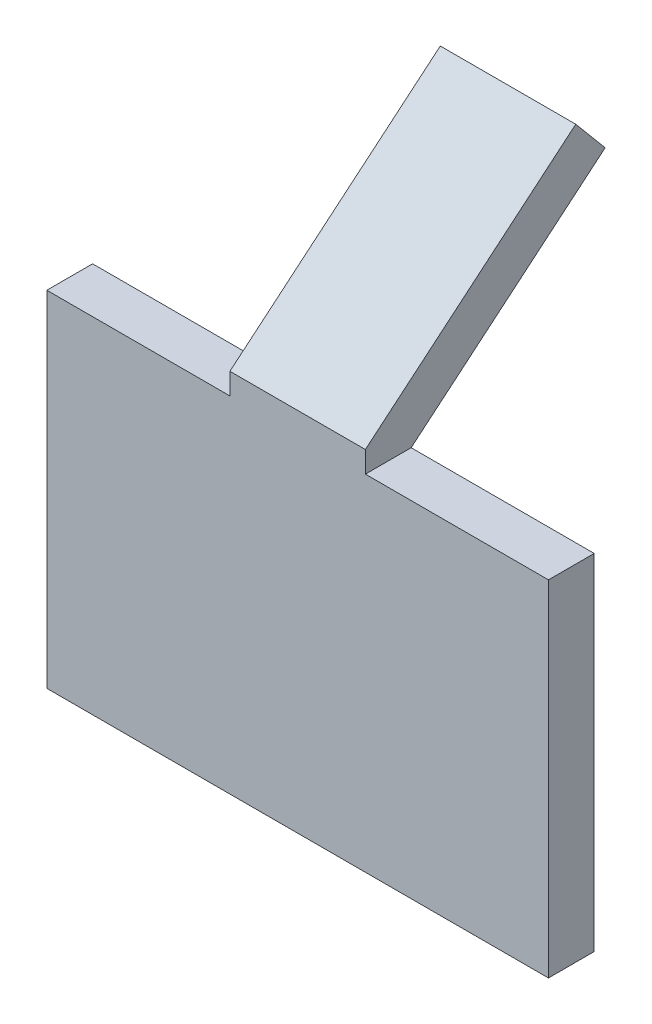
ISO-10303-21;
HEADER;
FILE_DESCRIPTION(('STEP AP214'),'2;1');
FILE_NAME('part.step','',(''),(''),'','','');
FILE_SCHEMA(('AUTOMOTIVE_DESIGN { 1 0 10303 214 1 1 1 1 }'));
ENDSEC;
DATA;
#1=APPLICATION_CONTEXT('core data for automotive mechanical design processes');
#2=APPLICATION_PROTOCOL_DEFINITION('international standard','automotive_design',2000,#1);
#3=PRODUCT_CONTEXT('',#1,'mechanical');
#4=PRODUCT('Part','Part','',(#3));
#5=PRODUCT_RELATED_PRODUCT_CATEGORY('part','',(#4));
#6=PRODUCT_DEFINITION_FORMATION('','',#4);
#7=PRODUCT_DEFINITION_CONTEXT('part definition',#1,'design');
#8=PRODUCT_DEFINITION('design','',#6,#7);
#9=PRODUCT_DEFINITION_SHAPE('','',#8);
#10=(LENGTH_UNIT() NAMED_UNIT(*) SI_UNIT(.MILLI.,.METRE.));
#11=(NAMED_UNIT(*) PLANE_ANGLE_UNIT() SI_UNIT($,.RADIAN.));
#12=(NAMED_UNIT(*) SI_UNIT($,.STERADIAN.) SOLID_ANGLE_UNIT());
#13=UNCERTAINTY_MEASURE_WITH_UNIT(LENGTH_MEASURE(1.E-05),#10,'distance_accuracy_value','');
#14=(GEOMETRIC_REPRESENTATION_CONTEXT(3) GLOBAL_UNCERTAINTY_ASSIGNED_CONTEXT((#13)) GLOBAL_UNIT_ASSIGNED_CONTEXT((#10,
#11,#12)) REPRESENTATION_CONTEXT('',''));
#15=CARTESIAN_POINT('',(0.,0.,0.));
#16=DIRECTION('',(0.,0.,1.));
#17=DIRECTION('',(1.,0.,0.));
#18=AXIS2_PLACEMENT_3D('',#15,#16,#17);
#19=CARTESIAN_POINT('',(18.796,0.,0.));
#20=DIRECTION('',(-1.,0.,0.));
#21=DIRECTION('',(0.,0.,1.));
#22=AXIS2_PLACEMENT_3D('',#19,#20,#21);
#23=PLANE('',#22);
#24=DIRECTION('',(0.,0.,1.));
#25=VECTOR('',#24,1.);
#26=CARTESIAN_POINT('',(18.796,-2.96105362928423,-6.35));
#27=LINE('',#26,#25);
#28=CARTESIAN_POINT('',(18.796,-2.96105362928423,-6.35000000000001));
#29=VERTEX_POINT('',#28);
#30=CARTESIAN_POINT('',(18.796,-2.96105362928424,0.));
#31=VERTEX_POINT('',#30);
#32=EDGE_CURVE('E163',#29,#31,#27,.T.);
#33=ORIENTED_EDGE('',*,*,#32,.F.);
#34=DIRECTION('',(0.,0.642787609686538,-0.766044443118979));
#35=VECTOR('',#34,1.);
#36=CARTESIAN_POINT('',(18.796,-2.96105362928423,-6.35000000000001));
#37=LINE('',#36,#35);
#38=CARTESIAN_POINT('',(18.796,19.6258257152516,-33.2679946043426));
#39=VERTEX_POINT('',#38);
#40=EDGE_CURVE('E192',#29,#39,#37,.T.);
#41=ORIENTED_EDGE('',*,*,#40,.T.);
#42=DIRECTION('',(0.,0.76604444311898,0.642787609686536));
#43=VECTOR('',#42,1.);
#44=CARTESIAN_POINT('',(18.796,19.6258257152516,-33.2679946043426));
#45=LINE('',#44,#43);
#46=CARTESIAN_POINT('',(18.796,24.4902079290571,-29.1862932828331));
#47=VERTEX_POINT('',#46);
#48=EDGE_CURVE('E64',#39,#47,#45,.T.);
#49=ORIENTED_EDGE('',*,*,#48,.T.);
#50=DIRECTION('',(0.,-0.642787609686538,0.766044443118979));
#51=VECTOR('',#50,1.);
#52=CARTESIAN_POINT('',(18.796,24.4902079290571,-29.1862932828331));
#53=LINE('',#52,#51);
#54=CARTESIAN_POINT('',(18.796,0.,0.));
#55=VERTEX_POINT('',#54);
#56=EDGE_CURVE('E187',#47,#55,#53,.T.);
#57=ORIENTED_EDGE('',*,*,#56,.T.);
#58=DIRECTION('',(0.,-1.,0.));
#59=VECTOR('',#58,1.);
#60=CARTESIAN_POINT('',(18.796,0.,0.));
#61=LINE('',#60,#59);
#62=EDGE_CURVE('E88',#55,#31,#61,.T.);
#63=ORIENTED_EDGE('',*,*,#62,.T.);
#64=EDGE_LOOP('',(#33,#41,#49,#57,#63));
#65=FACE_BOUND('',#64,.T.);
#66=ADVANCED_FACE('F39',(#65),#23,.F.);
#67=CARTESIAN_POINT('',(18.796,24.4902079290571,-29.1862932828331));
#68=DIRECTION('',(0.,-0.766044443118979,-0.642787609686538));
#69=DIRECTION('',(0.,0.642787609686538,-0.766044443118979));
#70=AXIS2_PLACEMENT_3D('',#67,#68,#69);
#71=PLANE('',#70);
#72=DIRECTION('',(0.,-0.642787609686538,0.766044443118979));
#73=VECTOR('',#72,1.);
#74=CARTESIAN_POINT('',(0.,24.4902079290571,-29.1862932828331));
#75=LINE('',#74,#73);
#76=CARTESIAN_POINT('',(0.,24.4902079290571,-29.1862932828331));
#77=VERTEX_POINT('',#76);
#78=CARTESIAN_POINT('',(0.,0.,0.));
#79=VERTEX_POINT('',#78);
#80=EDGE_CURVE('E186',#77,#79,#75,.T.);
#81=ORIENTED_EDGE('',*,*,#80,.T.);
#82=DIRECTION('',(-1.,0.,0.));
#83=VECTOR('',#82,1.);
#84=CARTESIAN_POINT('',(18.796,0.,0.));
#85=LINE('',#84,#83);
#86=EDGE_CURVE('E11',#55,#79,#85,.T.);
#87=ORIENTED_EDGE('',*,*,#86,.F.);
#88=ORIENTED_EDGE('',*,*,#56,.F.);
#89=DIRECTION('',(-1.,0.,0.));
#90=VECTOR('',#89,1.);
#91=CARTESIAN_POINT('',(18.796,24.4902079290571,-29.1862932828331));
#92=LINE('',#91,#90);
#93=EDGE_CURVE('E197',#47,#77,#92,.T.);
#94=ORIENTED_EDGE('',*,*,#93,.T.);
#95=EDGE_LOOP('',(#81,#87,#88,#94));
#96=FACE_BOUND('',#95,.T.);
#97=ADVANCED_FACE('F41',(#96),#71,.F.);
#98=CARTESIAN_POINT('',(18.796,0.,0.));
#99=DIRECTION('',(0.,0.,-1.));
#100=DIRECTION('',(0.,1.,0.));
#101=AXIS2_PLACEMENT_3D('',#98,#99,#100);
#102=PLANE('',#101);
#103=DIRECTION('',(0.,-1.,0.));
#104=VECTOR('',#103,1.);
#105=CARTESIAN_POINT('',(0.,0.,0.));
#106=LINE('',#105,#104);
#107=CARTESIAN_POINT('',(0.,-2.96105362928423,0.));
#108=VERTEX_POINT('',#107);
#109=EDGE_CURVE('E201',#79,#108,#106,.T.);
#110=ORIENTED_EDGE('',*,*,#109,.T.);
#111=DIRECTION('',(1.,0.,0.));
#112=VECTOR('',#111,1.);
#113=CARTESIAN_POINT('',(-25.4,-2.96105362928423,0.));
#114=LINE('',#113,#112);
#115=CARTESIAN_POINT('',(-25.4,-2.96105362928423,0.));
#116=VERTEX_POINT('',#115);
#117=EDGE_CURVE('E159',#116,#108,#114,.T.);
#118=ORIENTED_EDGE('',*,*,#117,.F.);
#119=DIRECTION('',(0.,1.,0.));
#120=VECTOR('',#119,1.);
#121=CARTESIAN_POINT('',(-25.4,-2.96105362928423,0.));
#122=LINE('',#121,#120);
#123=CARTESIAN_POINT('',(-25.4,-50.8,0.));
#124=VERTEX_POINT('',#123);
#125=EDGE_CURVE('E141',#124,#116,#122,.T.);
#126=ORIENTED_EDGE('',*,*,#125,.F.);
#127=DIRECTION('',(-1.,0.,0.));
#128=VECTOR('',#127,1.);
#129=CARTESIAN_POINT('',(18.796,-50.8,0.));
#130=LINE('',#129,#128);
#131=CARTESIAN_POINT('',(44.196,-50.8,0.));
#132=VERTEX_POINT('',#131);
#133=EDGE_CURVE('E48',#132,#124,#130,.T.);
#134=ORIENTED_EDGE('',*,*,#133,.F.);
#135=DIRECTION('',(0.,-1.,0.));
#136=VECTOR('',#135,1.);
#137=CARTESIAN_POINT('',(44.196,-2.96105362928424,0.));
#138=LINE('',#137,#136);
#139=CARTESIAN_POINT('',(44.196,-2.96105362928424,0.));
#140=VERTEX_POINT('',#139);
#141=EDGE_CURVE('E169',#140,#132,#138,.T.);
#142=ORIENTED_EDGE('',*,*,#141,.F.);
#143=DIRECTION('',(-1.,0.,0.));
#144=VECTOR('',#143,1.);
#145=CARTESIAN_POINT('',(44.196,-2.96105362928424,0.));
#146=LINE('',#145,#144);
#147=EDGE_CURVE('E176',#140,#31,#146,.T.);
#148=ORIENTED_EDGE('',*,*,#147,.T.);
#149=ORIENTED_EDGE('',*,*,#62,.F.);
#150=ORIENTED_EDGE('',*,*,#86,.T.);
#151=EDGE_LOOP('',(#110,#118,#126,#134,#142,#148,#149,#150));
#152=FACE_BOUND('',#151,.T.);
#153=ADVANCED_FACE('F225',(#152),#102,.F.);
#154=CARTESIAN_POINT('',(18.796,-50.8,0.));
#155=DIRECTION('',(0.,1.,0.));
#156=DIRECTION('',(0.,0.,1.));
#157=AXIS2_PLACEMENT_3D('',#154,#155,#156);
#158=PLANE('',#157);
#159=ORIENTED_EDGE('',*,*,#133,.T.);
#160=DIRECTION('',(0.,0.,1.));
#161=VECTOR('',#160,1.);
#162=CARTESIAN_POINT('',(-25.4,-50.8,-6.35000000000001));
#163=LINE('',#162,#161);
#164=CARTESIAN_POINT('',(-25.4,-50.8,-6.35000000000001));
#165=VERTEX_POINT('',#164);
#166=EDGE_CURVE('E136',#165,#124,#163,.T.);
#167=ORIENTED_EDGE('',*,*,#166,.F.);
#168=DIRECTION('',(-1.,0.,0.));
#169=VECTOR('',#168,1.);
#170=CARTESIAN_POINT('',(18.796,-50.8,-6.35));
#171=LINE('',#170,#169);
#172=CARTESIAN_POINT('',(44.196,-50.8,-6.35000000000001));
#173=VERTEX_POINT('',#172);
#174=EDGE_CURVE('E120',#173,#165,#171,.T.);
#175=ORIENTED_EDGE('',*,*,#174,.F.);
#176=DIRECTION('',(0.,0.,-1.));
#177=VECTOR('',#176,1.);
#178=CARTESIAN_POINT('',(44.196,-50.8,-6.35000000000001));
#179=LINE('',#178,#177);
#180=EDGE_CURVE('E173',#132,#173,#179,.T.);
#181=ORIENTED_EDGE('',*,*,#180,.F.);
#182=EDGE_LOOP('',(#159,#167,#175,#181));
#183=FACE_BOUND('',#182,.T.);
#184=ADVANCED_FACE('F137',(#183),#158,.F.);
#185=CARTESIAN_POINT('',(18.796,-50.8,-6.35));
#186=DIRECTION('',(0.,0.,1.));
#187=DIRECTION('',(0.,-1.,0.));
#188=AXIS2_PLACEMENT_3D('',#185,#186,#187);
#189=PLANE('',#188);
#190=ORIENTED_EDGE('',*,*,#174,.T.);
#191=DIRECTION('',(0.,-1.,0.));
#192=VECTOR('',#191,1.);
#193=CARTESIAN_POINT('',(-25.4,-2.96105362928423,-6.35000000000001));
#194=LINE('',#193,#192);
#195=CARTESIAN_POINT('',(-25.4,-2.96105362928423,-6.35000000000001));
#196=VERTEX_POINT('',#195);
#197=EDGE_CURVE('E125',#196,#165,#194,.T.);
#198=ORIENTED_EDGE('',*,*,#197,.F.);
#199=DIRECTION('',(1.,0.,0.));
#200=VECTOR('',#199,1.);
#201=CARTESIAN_POINT('',(-25.4,-2.96105362928423,-6.35000000000001));
#202=LINE('',#201,#200);
#203=CARTESIAN_POINT('',(0.,-2.96105362928423,-6.35000000000001));
#204=VERTEX_POINT('',#203);
#205=EDGE_CURVE('E155',#196,#204,#202,.T.);
#206=ORIENTED_EDGE('',*,*,#205,.T.);
#207=DIRECTION('',(-1.,0.,0.));
#208=VECTOR('',#207,1.);
#209=CARTESIAN_POINT('',(18.796,-2.96105362928423,-6.35000000000001));
#210=LINE('',#209,#208);
#211=EDGE_CURVE('E133',#29,#204,#210,.T.);
#212=ORIENTED_EDGE('',*,*,#211,.F.);
#213=DIRECTION('',(-1.,0.,0.));
#214=VECTOR('',#213,1.);
#215=CARTESIAN_POINT('',(44.196,-2.96105362928423,-6.35));
#216=LINE('',#215,#214);
#217=CARTESIAN_POINT('',(44.196,-2.96105362928423,-6.35));
#218=VERTEX_POINT('',#217);
#219=EDGE_CURVE('E182',#218,#29,#216,.T.);
#220=ORIENTED_EDGE('',*,*,#219,.F.);
#221=DIRECTION('',(0.,1.,0.));
#222=VECTOR('',#221,1.);
#223=CARTESIAN_POINT('',(44.196,-2.96105362928423,-6.35));
#224=LINE('',#223,#222);
#225=EDGE_CURVE('E128',#173,#218,#224,.T.);
#226=ORIENTED_EDGE('',*,*,#225,.F.);
#227=EDGE_LOOP('',(#190,#198,#206,#212,#220,#226));
#228=FACE_BOUND('',#227,.T.);
#229=ADVANCED_FACE('F122',(#228),#189,.F.);
#230=CARTESIAN_POINT('',(18.796,-2.96105362928423,-6.35000000000001));
#231=DIRECTION('',(0.,0.766044443118979,0.642787609686538));
#232=DIRECTION('',(0.,-0.642787609686538,0.766044443118979));
#233=AXIS2_PLACEMENT_3D('',#230,#231,#232);
#234=PLANE('',#233);
#235=DIRECTION('',(0.,0.642787609686538,-0.766044443118979));
#236=VECTOR('',#235,1.);
#237=CARTESIAN_POINT('',(0.,-2.96105362928423,-6.35000000000001));
#238=LINE('',#237,#236);
#239=CARTESIAN_POINT('',(0.,19.6258257152516,-33.2679946043426));
#240=VERTEX_POINT('',#239);
#241=EDGE_CURVE('E204',#204,#240,#238,.T.);
#242=ORIENTED_EDGE('',*,*,#241,.T.);
#243=DIRECTION('',(-1.,0.,0.));
#244=VECTOR('',#243,1.);
#245=CARTESIAN_POINT('',(18.796,19.6258257152516,-33.2679946043426));
#246=LINE('',#245,#244);
#247=EDGE_CURVE('E211',#39,#240,#246,.T.);
#248=ORIENTED_EDGE('',*,*,#247,.F.);
#249=ORIENTED_EDGE('',*,*,#40,.F.);
#250=ORIENTED_EDGE('',*,*,#211,.T.);
#251=EDGE_LOOP('',(#242,#248,#249,#250));
#252=FACE_BOUND('',#251,.T.);
#253=ADVANCED_FACE('F220',(#252),#234,.F.);
#254=CARTESIAN_POINT('',(18.796,19.6258257152516,-33.2679946043426));
#255=DIRECTION('',(0.,-0.642787609686536,0.76604444311898));
#256=DIRECTION('',(0.,-0.76604444311898,-0.642787609686536));
#257=AXIS2_PLACEMENT_3D('',#254,#255,#256);
#258=PLANE('',#257);
#259=DIRECTION('',(0.,0.76604444311898,0.642787609686536));
#260=VECTOR('',#259,1.);
#261=CARTESIAN_POINT('',(0.,19.6258257152516,-33.2679946043426));
#262=LINE('',#261,#260);
#263=EDGE_CURVE('E81',#240,#77,#262,.T.);
#264=ORIENTED_EDGE('',*,*,#263,.T.);
#265=ORIENTED_EDGE('',*,*,#93,.F.);
#266=ORIENTED_EDGE('',*,*,#48,.F.);
#267=ORIENTED_EDGE('',*,*,#247,.T.);
#268=EDGE_LOOP('',(#264,#265,#266,#267));
#269=FACE_BOUND('',#268,.T.);
#270=ADVANCED_FACE('F231',(#269),#258,.F.);
#271=CARTESIAN_POINT('',(0.,0.,0.));
#272=DIRECTION('',(-1.,0.,0.));
#273=DIRECTION('',(0.,0.,1.));
#274=AXIS2_PLACEMENT_3D('',#271,#272,#273);
#275=PLANE('',#274);
#276=DIRECTION('',(0.,0.,-1.));
#277=VECTOR('',#276,1.);
#278=CARTESIAN_POINT('',(0.,-2.96105362928423,-6.35000000000001));
#279=LINE('',#278,#277);
#280=EDGE_CURVE('E55',#108,#204,#279,.T.);
#281=ORIENTED_EDGE('',*,*,#280,.F.);
#282=ORIENTED_EDGE('',*,*,#109,.F.);
#283=ORIENTED_EDGE('',*,*,#80,.F.);
#284=ORIENTED_EDGE('',*,*,#263,.F.);
#285=ORIENTED_EDGE('',*,*,#241,.F.);
#286=EDGE_LOOP('',(#281,#282,#283,#284,#285));
#287=FACE_BOUND('',#286,.T.);
#288=ADVANCED_FACE('F228',(#287),#275,.T.);
#289=CARTESIAN_POINT('',(44.196,-2.96105362928423,-6.35));
#290=DIRECTION('',(0.,-1.,0.));
#291=DIRECTION('',(0.,0.,-1.));
#292=AXIS2_PLACEMENT_3D('',#289,#290,#291);
#293=PLANE('',#292);
#294=ORIENTED_EDGE('',*,*,#32,.T.);
#295=ORIENTED_EDGE('',*,*,#147,.F.);
#296=DIRECTION('',(0.,0.,1.));
#297=VECTOR('',#296,1.);
#298=CARTESIAN_POINT('',(44.196,-2.96105362928423,-6.35));
#299=LINE('',#298,#297);
#300=EDGE_CURVE('E166',#218,#140,#299,.T.);
#301=ORIENTED_EDGE('',*,*,#300,.F.);
#302=ORIENTED_EDGE('',*,*,#219,.T.);
#303=EDGE_LOOP('',(#294,#295,#301,#302));
#304=FACE_BOUND('',#303,.T.);
#305=ADVANCED_FACE('F238',(#304),#293,.F.);
#306=CARTESIAN_POINT('',(44.196,0.,0.));
#307=DIRECTION('',(-1.,0.,0.));
#308=DIRECTION('',(0.,0.,1.));
#309=AXIS2_PLACEMENT_3D('',#306,#307,#308);
#310=PLANE('',#309);
#311=ORIENTED_EDGE('',*,*,#225,.T.);
#312=ORIENTED_EDGE('',*,*,#300,.T.);
#313=ORIENTED_EDGE('',*,*,#141,.T.);
#314=ORIENTED_EDGE('',*,*,#180,.T.);
#315=EDGE_LOOP('',(#311,#312,#313,#314));
#316=FACE_BOUND('',#315,.T.);
#317=ADVANCED_FACE('F249',(#316),#310,.F.);
#318=CARTESIAN_POINT('',(-25.4,-2.96105362928423,-6.35000000000001));
#319=DIRECTION('',(0.,-1.,0.));
#320=DIRECTION('',(0.,0.,-1.));
#321=AXIS2_PLACEMENT_3D('',#318,#319,#320);
#322=PLANE('',#321);
#323=ORIENTED_EDGE('',*,*,#280,.T.);
#324=ORIENTED_EDGE('',*,*,#205,.F.);
#325=DIRECTION('',(0.,0.,-1.));
#326=VECTOR('',#325,1.);
#327=CARTESIAN_POINT('',(-25.4,-2.96105362928423,-6.35000000000001));
#328=LINE('',#327,#326);
#329=EDGE_CURVE('E145',#116,#196,#328,.T.);
#330=ORIENTED_EDGE('',*,*,#329,.F.);
#331=ORIENTED_EDGE('',*,*,#117,.T.);
#332=EDGE_LOOP('',(#323,#324,#330,#331));
#333=FACE_BOUND('',#332,.T.);
#334=ADVANCED_FACE('F223',(#333),#322,.F.);
#335=CARTESIAN_POINT('',(-25.4,0.,0.));
#336=DIRECTION('',(-1.,0.,0.));
#337=DIRECTION('',(0.,0.,1.));
#338=AXIS2_PLACEMENT_3D('',#335,#336,#337);
#339=PLANE('',#338);
#340=ORIENTED_EDGE('',*,*,#197,.T.);
#341=ORIENTED_EDGE('',*,*,#166,.T.);
#342=ORIENTED_EDGE('',*,*,#125,.T.);
#343=ORIENTED_EDGE('',*,*,#329,.T.);
#344=EDGE_LOOP('',(#340,#341,#342,#343));
#345=FACE_BOUND('',#344,.T.);
#346=ADVANCED_FACE('F143',(#345),#339,.T.);
#347=CLOSED_SHELL('',(#66,#97,#153,#184,#229,#253,#270,#288,#305,#317,#334,#346));
#348=MANIFOLD_SOLID_BREP('B2',#347);
#349=ADVANCED_BREP_SHAPE_REPRESENTATION('',(#18,#348),#14);
#350=SHAPE_DEFINITION_REPRESENTATION(#9,#349);
ENDSEC;
END-ISO-10303-21;
